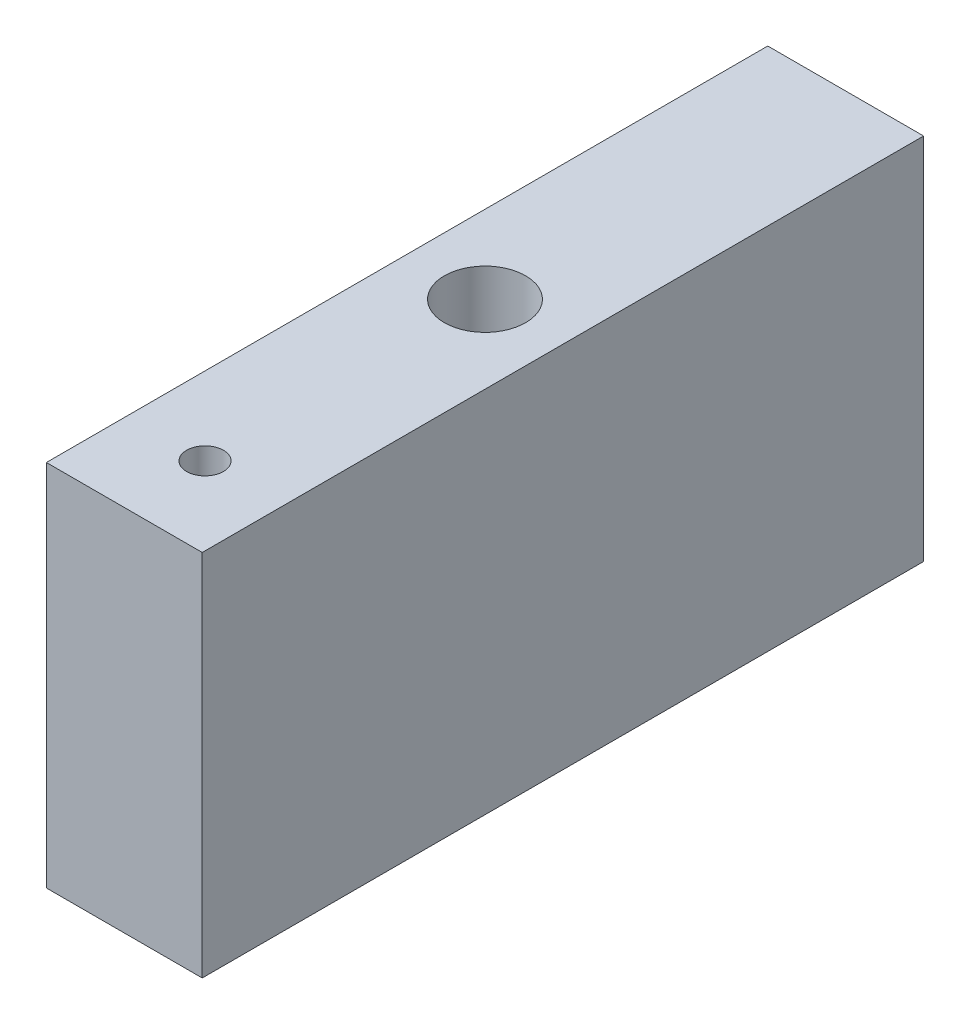
ISO-10303-21;
HEADER;
FILE_DESCRIPTION(('STEP AP214'),'2;1');
FILE_NAME('part.step','',(''),(''),'','','');
FILE_SCHEMA(('AUTOMOTIVE_DESIGN { 1 0 10303 214 1 1 1 1 }'));
ENDSEC;
DATA;
#1=APPLICATION_CONTEXT('core data for automotive mechanical design processes');
#2=APPLICATION_PROTOCOL_DEFINITION('international standard','automotive_design',2000,#1);
#3=PRODUCT_CONTEXT('',#1,'mechanical');
#4=PRODUCT('Part','Part','',(#3));
#5=PRODUCT_RELATED_PRODUCT_CATEGORY('part','',(#4));
#6=PRODUCT_DEFINITION_FORMATION('','',#4);
#7=PRODUCT_DEFINITION_CONTEXT('part definition',#1,'design');
#8=PRODUCT_DEFINITION('design','',#6,#7);
#9=PRODUCT_DEFINITION_SHAPE('','',#8);
#10=(LENGTH_UNIT() NAMED_UNIT(*) SI_UNIT(.MILLI.,.METRE.));
#11=(NAMED_UNIT(*) PLANE_ANGLE_UNIT() SI_UNIT($,.RADIAN.));
#12=(NAMED_UNIT(*) SI_UNIT($,.STERADIAN.) SOLID_ANGLE_UNIT());
#13=UNCERTAINTY_MEASURE_WITH_UNIT(LENGTH_MEASURE(1.E-05),#10,'distance_accuracy_value','');
#14=(GEOMETRIC_REPRESENTATION_CONTEXT(3) GLOBAL_UNCERTAINTY_ASSIGNED_CONTEXT((#13)) GLOBAL_UNIT_ASSIGNED_CONTEXT((#10,
#11,#12)) REPRESENTATION_CONTEXT('',''));
#15=CARTESIAN_POINT('',(0.,0.,0.));
#16=DIRECTION('',(0.,0.,1.));
#17=DIRECTION('',(1.,0.,0.));
#18=AXIS2_PLACEMENT_3D('',#15,#16,#17);
#19=CARTESIAN_POINT('',(0.,22.6934424355188,4.3));
#20=DIRECTION('',(0.,0.,-1.));
#21=DIRECTION('',(-1.,0.,0.));
#22=AXIS2_PLACEMENT_3D('',#19,#20,#21);
#23=PLANE('',#22);
#24=DIRECTION('',(1.,0.,0.));
#25=VECTOR('',#24,1.);
#26=CARTESIAN_POINT('',(0.,4.533910891089,4.3));
#27=LINE('',#26,#25);
#28=CARTESIAN_POINT('',(-1.917425742574,4.533910891089,4.3));
#29=VERTEX_POINT('',#28);
#30=CARTESIAN_POINT('',(1.917425742574,4.533910891089,4.3));
#31=VERTEX_POINT('',#30);
#32=EDGE_CURVE('E87',#29,#31,#27,.T.);
#33=ORIENTED_EDGE('',*,*,#32,.F.);
#34=DIRECTION('',(0.,-1.,0.));
#35=VECTOR('',#34,1.);
#36=CARTESIAN_POINT('',(-1.917425742574,22.6934424355188,4.3));
#37=LINE('',#36,#35);
#38=CARTESIAN_POINT('',(-1.917425742574,-4.533910891089,4.3));
#39=VERTEX_POINT('',#38);
#40=EDGE_CURVE('E56',#29,#39,#37,.T.);
#41=ORIENTED_EDGE('',*,*,#40,.T.);
#42=DIRECTION('',(1.,0.,0.));
#43=VECTOR('',#42,1.);
#44=CARTESIAN_POINT('',(0.,-4.533910891089,4.3));
#45=LINE('',#44,#43);
#46=CARTESIAN_POINT('',(1.917425742574,-4.533910891089,4.3));
#47=VERTEX_POINT('',#46);
#48=EDGE_CURVE('E89',#39,#47,#45,.T.);
#49=ORIENTED_EDGE('',*,*,#48,.T.);
#50=DIRECTION('',(0.,-1.,0.));
#51=VECTOR('',#50,1.);
#52=CARTESIAN_POINT('',(1.917425742574,22.6934424355188,4.3));
#53=LINE('',#52,#51);
#54=EDGE_CURVE('E83',#31,#47,#53,.T.);
#55=ORIENTED_EDGE('',*,*,#54,.F.);
#56=EDGE_LOOP('',(#33,#41,#49,#55));
#57=FACE_BOUND('',#56,.T.);
#58=ADVANCED_FACE('F43',(#57),#23,.F.);
#59=CARTESIAN_POINT('',(-1.917425742574,22.6934424355188,0.));
#60=DIRECTION('',(1.,0.,0.));
#61=DIRECTION('',(0.,0.,-1.));
#62=AXIS2_PLACEMENT_3D('',#59,#60,#61);
#63=PLANE('',#62);
#64=DIRECTION('',(0.,0.,1.));
#65=VECTOR('',#64,1.);
#66=CARTESIAN_POINT('',(-1.917425742574,4.533910891089,0.));
#67=LINE('',#66,#65);
#68=CARTESIAN_POINT('',(-1.917425742574,4.533910891089,-13.45));
#69=VERTEX_POINT('',#68);
#70=EDGE_CURVE('E103',#69,#29,#67,.T.);
#71=ORIENTED_EDGE('',*,*,#70,.F.);
#72=DIRECTION('',(0.,-1.,0.));
#73=VECTOR('',#72,1.);
#74=CARTESIAN_POINT('',(-1.917425742574,22.6934424355188,-13.45));
#75=LINE('',#74,#73);
#76=CARTESIAN_POINT('',(-1.917425742574,-4.533910891089,-13.45));
#77=VERTEX_POINT('',#76);
#78=EDGE_CURVE('E55',#69,#77,#75,.T.);
#79=ORIENTED_EDGE('',*,*,#78,.T.);
#80=DIRECTION('',(0.,0.,1.));
#81=VECTOR('',#80,1.);
#82=CARTESIAN_POINT('',(-1.917425742574,-4.533910891089,0.));
#83=LINE('',#82,#81);
#84=EDGE_CURVE('E119',#77,#39,#83,.T.);
#85=ORIENTED_EDGE('',*,*,#84,.T.);
#86=ORIENTED_EDGE('',*,*,#40,.F.);
#87=EDGE_LOOP('',(#71,#79,#85,#86));
#88=FACE_BOUND('',#87,.T.);
#89=ADVANCED_FACE('F123',(#88),#63,.F.);
#90=CARTESIAN_POINT('',(0.,22.6934424355188,-13.45));
#91=DIRECTION('',(0.,0.,1.));
#92=DIRECTION('',(1.,0.,0.));
#93=AXIS2_PLACEMENT_3D('',#90,#91,#92);
#94=PLANE('',#93);
#95=DIRECTION('',(-1.,0.,0.));
#96=VECTOR('',#95,1.);
#97=CARTESIAN_POINT('',(0.,4.533910891089,-13.45));
#98=LINE('',#97,#96);
#99=CARTESIAN_POINT('',(1.917425742574,4.533910891089,-13.45));
#100=VERTEX_POINT('',#99);
#101=EDGE_CURVE('E66',#100,#69,#98,.T.);
#102=ORIENTED_EDGE('',*,*,#101,.F.);
#103=DIRECTION('',(0.,-1.,0.));
#104=VECTOR('',#103,1.);
#105=CARTESIAN_POINT('',(1.917425742574,22.6934424355188,-13.45));
#106=LINE('',#105,#104);
#107=CARTESIAN_POINT('',(1.917425742574,-4.533910891089,-13.45));
#108=VERTEX_POINT('',#107);
#109=EDGE_CURVE('E11',#100,#108,#106,.T.);
#110=ORIENTED_EDGE('',*,*,#109,.T.);
#111=DIRECTION('',(-1.,0.,0.));
#112=VECTOR('',#111,1.);
#113=CARTESIAN_POINT('',(0.,-4.533910891089,-13.45));
#114=LINE('',#113,#112);
#115=EDGE_CURVE('E113',#108,#77,#114,.T.);
#116=ORIENTED_EDGE('',*,*,#115,.T.);
#117=ORIENTED_EDGE('',*,*,#78,.F.);
#118=EDGE_LOOP('',(#102,#110,#116,#117));
#119=FACE_BOUND('',#118,.T.);
#120=ADVANCED_FACE('F130',(#119),#94,.F.);
#121=CARTESIAN_POINT('',(1.917425742574,22.6934424355188,0.));
#122=DIRECTION('',(-1.,0.,0.));
#123=DIRECTION('',(0.,0.,1.));
#124=AXIS2_PLACEMENT_3D('',#121,#122,#123);
#125=PLANE('',#124);
#126=DIRECTION('',(0.,0.,-1.));
#127=VECTOR('',#126,1.);
#128=CARTESIAN_POINT('',(1.917425742574,4.533910891089,0.));
#129=LINE('',#128,#127);
#130=EDGE_CURVE('E100',#31,#100,#129,.T.);
#131=ORIENTED_EDGE('',*,*,#130,.F.);
#132=ORIENTED_EDGE('',*,*,#54,.T.);
#133=DIRECTION('',(0.,0.,-1.));
#134=VECTOR('',#133,1.);
#135=CARTESIAN_POINT('',(1.917425742574,-4.533910891089,0.));
#136=LINE('',#135,#134);
#137=EDGE_CURVE('E114',#47,#108,#136,.T.);
#138=ORIENTED_EDGE('',*,*,#137,.T.);
#139=ORIENTED_EDGE('',*,*,#109,.F.);
#140=EDGE_LOOP('',(#131,#132,#138,#139));
#141=FACE_BOUND('',#140,.T.);
#142=ADVANCED_FACE('F98',(#141),#125,.F.);
#143=CARTESIAN_POINT('',(0.,22.6934424355188,2.31420471614287));
#144=DIRECTION('',(0.,-1.,0.));
#145=DIRECTION('',(0.,0.,-1.));
#146=AXIS2_PLACEMENT_3D('',#143,#144,#145);
#147=CYLINDRICAL_SURFACE('',#146,0.453608998039042);
#148=CARTESIAN_POINT('',(0.,-4.533910891089,2.31420471614287));
#149=DIRECTION('',(0.,1.,0.));
#150=DIRECTION('',(0.,0.,1.));
#151=AXIS2_PLACEMENT_3D('',#148,#149,#150);
#152=CIRCLE('',#151,0.453608998039042);
#153=CARTESIAN_POINT('',(0.,-4.533910891089,2.76781371418191));
#154=VERTEX_POINT('',#153);
#155=EDGE_CURVE('E99',#154,#154,#152,.T.);
#156=ORIENTED_EDGE('',*,*,#155,.F.);
#157=EDGE_LOOP('',(#156));
#158=FACE_BOUND('',#157,.T.);
#159=CARTESIAN_POINT('',(0.,4.533910891089,2.31420471614287));
#160=DIRECTION('',(0.,1.,0.));
#161=DIRECTION('',(0.,0.,1.));
#162=AXIS2_PLACEMENT_3D('',#159,#160,#161);
#163=CIRCLE('',#162,0.453608998039042);
#164=CARTESIAN_POINT('',(0.,4.533910891089,2.76781371418191));
#165=VERTEX_POINT('',#164);
#166=EDGE_CURVE('E102',#165,#165,#163,.T.);
#167=ORIENTED_EDGE('',*,*,#166,.T.);
#168=EDGE_LOOP('',(#167));
#169=FACE_BOUND('',#168,.T.);
#170=ADVANCED_FACE('F44',(#158,#169),#147,.F.);
#171=CARTESIAN_POINT('',(0.,-4.533910891089,0.));
#172=DIRECTION('',(0.,1.,0.));
#173=DIRECTION('',(0.,0.,1.));
#174=AXIS2_PLACEMENT_3D('',#171,#172,#173);
#175=PLANE('',#174);
#176=ORIENTED_EDGE('',*,*,#155,.T.);
#177=EDGE_LOOP('',(#176));
#178=FACE_BOUND('',#177,.T.);
#179=ORIENTED_EDGE('',*,*,#137,.F.);
#180=ORIENTED_EDGE('',*,*,#48,.F.);
#181=ORIENTED_EDGE('',*,*,#84,.F.);
#182=ORIENTED_EDGE('',*,*,#115,.F.);
#183=EDGE_LOOP('',(#179,#180,#181,#182));
#184=FACE_BOUND('',#183,.T.);
#185=CARTESIAN_POINT('',(0.,-4.533910891089,-4.575));
#186=DIRECTION('',(0.,1.,0.));
#187=DIRECTION('',(0.,0.,1.));
#188=AXIS2_PLACEMENT_3D('',#185,#186,#187);
#189=CIRCLE('',#188,1.);
#190=CARTESIAN_POINT('',(0.,-4.533910891089,-3.575));
#191=VERTEX_POINT('',#190);
#192=EDGE_CURVE('E94',#191,#191,#189,.T.);
#193=ORIENTED_EDGE('',*,*,#192,.T.);
#194=EDGE_LOOP('',(#193));
#195=FACE_BOUND('',#194,.T.);
#196=ADVANCED_FACE('F129',(#178,#184,#195),#175,.F.);
#197=CARTESIAN_POINT('',(0.,22.6934424355188,-4.575));
#198=DIRECTION('',(0.,-1.,0.));
#199=DIRECTION('',(0.,0.,-1.));
#200=AXIS2_PLACEMENT_3D('',#197,#198,#199);
#201=CYLINDRICAL_SURFACE('',#200,1.);
#202=ORIENTED_EDGE('',*,*,#192,.F.);
#203=EDGE_LOOP('',(#202));
#204=FACE_BOUND('',#203,.T.);
#205=CARTESIAN_POINT('',(0.,4.533910891089,-4.575));
#206=DIRECTION('',(0.,1.,0.));
#207=DIRECTION('',(0.,0.,1.));
#208=AXIS2_PLACEMENT_3D('',#205,#206,#207);
#209=CIRCLE('',#208,1.);
#210=CARTESIAN_POINT('',(0.,4.533910891089,-3.575));
#211=VERTEX_POINT('',#210);
#212=EDGE_CURVE('E50',#211,#211,#209,.T.);
#213=ORIENTED_EDGE('',*,*,#212,.T.);
#214=EDGE_LOOP('',(#213));
#215=FACE_BOUND('',#214,.T.);
#216=ADVANCED_FACE('F135',(#204,#215),#201,.F.);
#217=CARTESIAN_POINT('',(-1.917425742574,4.533910891089,-1.));
#218=DIRECTION('',(0.,1.,0.));
#219=DIRECTION('',(1.,0.,0.));
#220=AXIS2_PLACEMENT_3D('',#217,#218,#219);
#221=PLANE('',#220);
#222=ORIENTED_EDGE('',*,*,#212,.F.);
#223=EDGE_LOOP('',(#222));
#224=FACE_BOUND('',#223,.T.);
#225=ORIENTED_EDGE('',*,*,#166,.F.);
#226=EDGE_LOOP('',(#225));
#227=FACE_BOUND('',#226,.T.);
#228=ORIENTED_EDGE('',*,*,#32,.T.);
#229=ORIENTED_EDGE('',*,*,#130,.T.);
#230=ORIENTED_EDGE('',*,*,#101,.T.);
#231=ORIENTED_EDGE('',*,*,#70,.T.);
#232=EDGE_LOOP('',(#228,#229,#230,#231));
#233=FACE_BOUND('',#232,.T.);
#234=ADVANCED_FACE('F105',(#224,#227,#233),#221,.T.);
#235=CLOSED_SHELL('',(#58,#89,#120,#142,#170,#196,#216,#234));
#236=MANIFOLD_SOLID_BREP('B2',#235);
#237=ADVANCED_BREP_SHAPE_REPRESENTATION('',(#18,#236),#14);
#238=SHAPE_DEFINITION_REPRESENTATION(#9,#237);
ENDSEC;
END-ISO-10303-21;
